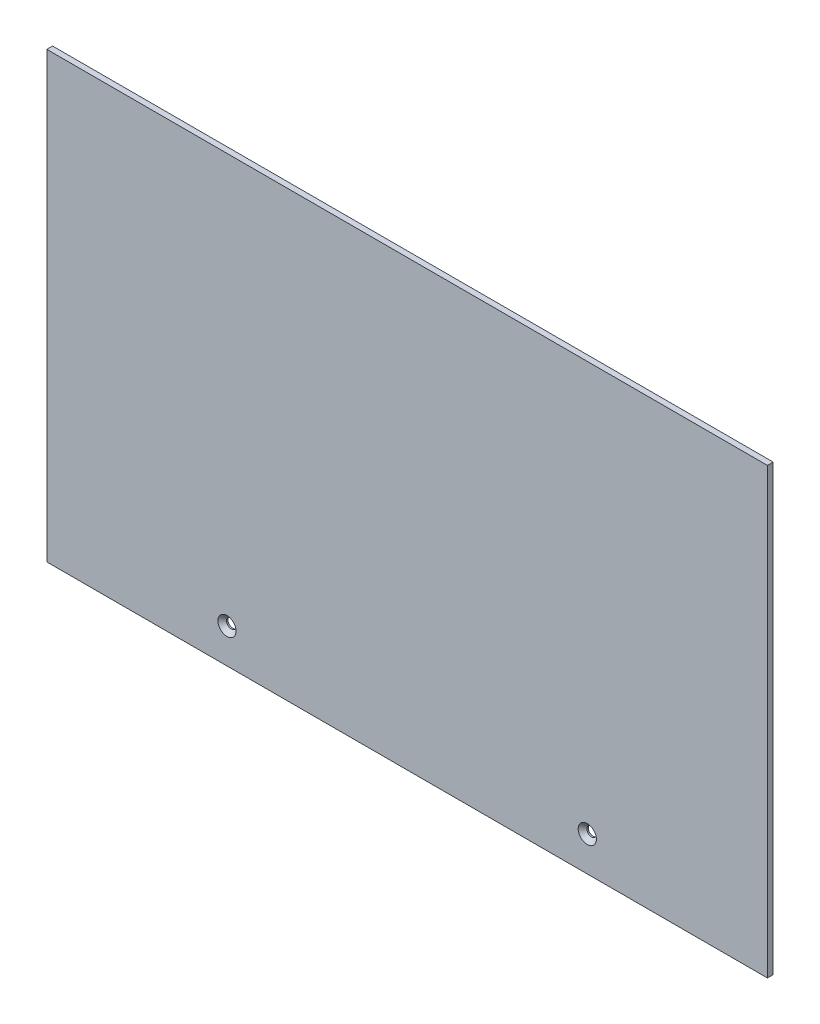
ISO-10303-21;
HEADER;
FILE_DESCRIPTION(('STEP AP214'),'2;1');
FILE_NAME('part.step','',(''),(''),'','','');
FILE_SCHEMA(('AUTOMOTIVE_DESIGN { 1 0 10303 214 1 1 1 1 }'));
ENDSEC;
DATA;
#1=APPLICATION_CONTEXT('core data for automotive mechanical design processes');
#2=APPLICATION_PROTOCOL_DEFINITION('international standard','automotive_design',2000,#1);
#3=PRODUCT_CONTEXT('',#1,'mechanical');
#4=PRODUCT('Part','Part','',(#3));
#5=PRODUCT_RELATED_PRODUCT_CATEGORY('part','',(#4));
#6=PRODUCT_DEFINITION_FORMATION('','',#4);
#7=PRODUCT_DEFINITION_CONTEXT('part definition',#1,'design');
#8=PRODUCT_DEFINITION('design','',#6,#7);
#9=PRODUCT_DEFINITION_SHAPE('','',#8);
#10=(LENGTH_UNIT() NAMED_UNIT(*) SI_UNIT(.MILLI.,.METRE.));
#11=(NAMED_UNIT(*) PLANE_ANGLE_UNIT() SI_UNIT($,.RADIAN.));
#12=(NAMED_UNIT(*) SI_UNIT($,.STERADIAN.) SOLID_ANGLE_UNIT());
#13=UNCERTAINTY_MEASURE_WITH_UNIT(LENGTH_MEASURE(1.E-05),#10,'distance_accuracy_value','');
#14=(GEOMETRIC_REPRESENTATION_CONTEXT(3) GLOBAL_UNCERTAINTY_ASSIGNED_CONTEXT((#13)) GLOBAL_UNIT_ASSIGNED_CONTEXT((#10,
#11,#12)) REPRESENTATION_CONTEXT('',''));
#15=CARTESIAN_POINT('',(0.,0.,0.));
#16=DIRECTION('',(0.,0.,1.));
#17=DIRECTION('',(1.,0.,0.));
#18=AXIS2_PLACEMENT_3D('',#15,#16,#17);
#19=CARTESIAN_POINT('',(0.,0.,-2.));
#20=DIRECTION('',(0.,0.,-1.));
#21=DIRECTION('',(-1.,0.,0.));
#22=AXIS2_PLACEMENT_3D('',#19,#20,#21);
#23=PLANE('',#22);
#24=DIRECTION('',(0.,-1.,0.));
#25=VECTOR('',#24,1.);
#26=CARTESIAN_POINT('',(-250.,308.,-2.));
#27=LINE('',#26,#25);
#28=CARTESIAN_POINT('',(-250.,308.,-2.));
#29=VERTEX_POINT('',#28);
#30=CARTESIAN_POINT('',(-250.,0.,-2.));
#31=VERTEX_POINT('',#30);
#32=EDGE_CURVE('E105',#29,#31,#27,.T.);
#33=ORIENTED_EDGE('',*,*,#32,.F.);
#34=DIRECTION('',(-1.,0.,0.));
#35=VECTOR('',#34,1.);
#36=CARTESIAN_POINT('',(250.,308.,-2.));
#37=LINE('',#36,#35);
#38=CARTESIAN_POINT('',(250.,308.,-2.));
#39=VERTEX_POINT('',#38);
#40=EDGE_CURVE('E77',#39,#29,#37,.T.);
#41=ORIENTED_EDGE('',*,*,#40,.F.);
#42=DIRECTION('',(0.,1.,0.));
#43=VECTOR('',#42,1.);
#44=CARTESIAN_POINT('',(250.,308.,-2.));
#45=LINE('',#44,#43);
#46=CARTESIAN_POINT('',(250.,0.,-2.));
#47=VERTEX_POINT('',#46);
#48=EDGE_CURVE('E75',#47,#39,#45,.T.);
#49=ORIENTED_EDGE('',*,*,#48,.F.);
#50=DIRECTION('',(1.,0.,0.));
#51=VECTOR('',#50,1.);
#52=CARTESIAN_POINT('',(250.,0.,-2.));
#53=LINE('',#52,#51);
#54=EDGE_CURVE('E94',#31,#47,#53,.T.);
#55=ORIENTED_EDGE('',*,*,#54,.F.);
#56=EDGE_LOOP('',(#33,#41,#49,#55));
#57=FACE_BOUND('',#56,.T.);
#58=CARTESIAN_POINT('',(125.,24.,-2.));
#59=DIRECTION('',(0.,0.,1.));
#60=DIRECTION('',(1.,0.,0.));
#61=AXIS2_PLACEMENT_3D('',#58,#59,#60);
#62=CIRCLE('',#61,3.3);
#63=CARTESIAN_POINT('',(128.3,24.,-2.));
#64=VERTEX_POINT('',#63);
#65=EDGE_CURVE('E104',#64,#64,#62,.T.);
#66=ORIENTED_EDGE('',*,*,#65,.T.);
#67=EDGE_LOOP('',(#66));
#68=FACE_BOUND('',#67,.T.);
#69=CARTESIAN_POINT('',(-125.,24.,-2.));
#70=DIRECTION('',(0.,0.,1.));
#71=DIRECTION('',(1.,0.,0.));
#72=AXIS2_PLACEMENT_3D('',#69,#70,#71);
#73=CIRCLE('',#72,3.29999999999998);
#74=CARTESIAN_POINT('',(-121.7,24.,-2.));
#75=VERTEX_POINT('',#74);
#76=EDGE_CURVE('E121',#75,#75,#73,.T.);
#77=ORIENTED_EDGE('',*,*,#76,.T.);
#78=EDGE_LOOP('',(#77));
#79=FACE_BOUND('',#78,.T.);
#80=ADVANCED_FACE('F36',(#57,#68,#79),#23,.T.);
#81=CARTESIAN_POINT('',(-250.,308.,2.));
#82=DIRECTION('',(1.,0.,0.));
#83=DIRECTION('',(0.,0.,-1.));
#84=AXIS2_PLACEMENT_3D('',#81,#82,#83);
#85=PLANE('',#84);
#86=ORIENTED_EDGE('',*,*,#32,.T.);
#87=DIRECTION('',(0.,0.,-1.));
#88=VECTOR('',#87,1.);
#89=CARTESIAN_POINT('',(-250.,0.,2.));
#90=LINE('',#89,#88);
#91=CARTESIAN_POINT('',(-250.,0.,2.));
#92=VERTEX_POINT('',#91);
#93=EDGE_CURVE('E11',#92,#31,#90,.T.);
#94=ORIENTED_EDGE('',*,*,#93,.F.);
#95=DIRECTION('',(0.,-1.,0.));
#96=VECTOR('',#95,1.);
#97=CARTESIAN_POINT('',(-250.,308.,2.));
#98=LINE('',#97,#96);
#99=CARTESIAN_POINT('',(-250.,308.,2.));
#100=VERTEX_POINT('',#99);
#101=EDGE_CURVE('E89',#100,#92,#98,.T.);
#102=ORIENTED_EDGE('',*,*,#101,.F.);
#103=DIRECTION('',(0.,0.,-1.));
#104=VECTOR('',#103,1.);
#105=CARTESIAN_POINT('',(-250.,308.,2.));
#106=LINE('',#105,#104);
#107=EDGE_CURVE('E98',#100,#29,#106,.T.);
#108=ORIENTED_EDGE('',*,*,#107,.T.);
#109=EDGE_LOOP('',(#86,#94,#102,#108));
#110=FACE_BOUND('',#109,.T.);
#111=ADVANCED_FACE('F37',(#110),#85,.F.);
#112=CARTESIAN_POINT('',(250.,0.,2.));
#113=DIRECTION('',(0.,1.,0.));
#114=DIRECTION('',(-1.,0.,0.));
#115=AXIS2_PLACEMENT_3D('',#112,#113,#114);
#116=PLANE('',#115);
#117=ORIENTED_EDGE('',*,*,#54,.T.);
#118=DIRECTION('',(0.,0.,-1.));
#119=VECTOR('',#118,1.);
#120=CARTESIAN_POINT('',(250.,0.,2.));
#121=LINE('',#120,#119);
#122=CARTESIAN_POINT('',(250.,0.,2.));
#123=VERTEX_POINT('',#122);
#124=EDGE_CURVE('E50',#123,#47,#121,.T.);
#125=ORIENTED_EDGE('',*,*,#124,.F.);
#126=DIRECTION('',(1.,0.,0.));
#127=VECTOR('',#126,1.);
#128=CARTESIAN_POINT('',(250.,0.,2.));
#129=LINE('',#128,#127);
#130=EDGE_CURVE('E83',#92,#123,#129,.T.);
#131=ORIENTED_EDGE('',*,*,#130,.F.);
#132=ORIENTED_EDGE('',*,*,#93,.T.);
#133=EDGE_LOOP('',(#117,#125,#131,#132));
#134=FACE_BOUND('',#133,.T.);
#135=ADVANCED_FACE('F91',(#134),#116,.F.);
#136=CARTESIAN_POINT('',(250.,308.,2.));
#137=DIRECTION('',(-1.,0.,0.));
#138=DIRECTION('',(0.,0.,1.));
#139=AXIS2_PLACEMENT_3D('',#136,#137,#138);
#140=PLANE('',#139);
#141=ORIENTED_EDGE('',*,*,#48,.T.);
#142=DIRECTION('',(0.,0.,-1.));
#143=VECTOR('',#142,1.);
#144=CARTESIAN_POINT('',(250.,308.,2.));
#145=LINE('',#144,#143);
#146=CARTESIAN_POINT('',(250.,308.,2.));
#147=VERTEX_POINT('',#146);
#148=EDGE_CURVE('E92',#147,#39,#145,.T.);
#149=ORIENTED_EDGE('',*,*,#148,.F.);
#150=DIRECTION('',(0.,1.,0.));
#151=VECTOR('',#150,1.);
#152=CARTESIAN_POINT('',(250.,308.,2.));
#153=LINE('',#152,#151);
#154=EDGE_CURVE('E86',#123,#147,#153,.T.);
#155=ORIENTED_EDGE('',*,*,#154,.F.);
#156=ORIENTED_EDGE('',*,*,#124,.T.);
#157=EDGE_LOOP('',(#141,#149,#155,#156));
#158=FACE_BOUND('',#157,.T.);
#159=ADVANCED_FACE('F96',(#158),#140,.F.);
#160=CARTESIAN_POINT('',(250.,308.,2.));
#161=DIRECTION('',(0.,-1.,0.));
#162=DIRECTION('',(1.,0.,0.));
#163=AXIS2_PLACEMENT_3D('',#160,#161,#162);
#164=PLANE('',#163);
#165=ORIENTED_EDGE('',*,*,#40,.T.);
#166=ORIENTED_EDGE('',*,*,#107,.F.);
#167=DIRECTION('',(-1.,0.,0.));
#168=VECTOR('',#167,1.);
#169=CARTESIAN_POINT('',(250.,308.,2.));
#170=LINE('',#169,#168);
#171=EDGE_CURVE('E54',#147,#100,#170,.T.);
#172=ORIENTED_EDGE('',*,*,#171,.F.);
#173=ORIENTED_EDGE('',*,*,#148,.T.);
#174=EDGE_LOOP('',(#165,#166,#172,#173));
#175=FACE_BOUND('',#174,.T.);
#176=ADVANCED_FACE('F109',(#175),#164,.F.);
#177=CARTESIAN_POINT('',(0.,0.,2.));
#178=DIRECTION('',(0.,0.,-1.));
#179=DIRECTION('',(-1.,0.,0.));
#180=AXIS2_PLACEMENT_3D('',#177,#178,#179);
#181=PLANE('',#180);
#182=CARTESIAN_POINT('',(-125.,24.,2.));
#183=DIRECTION('',(0.,0.,1.));
#184=DIRECTION('',(1.,0.,0.));
#185=AXIS2_PLACEMENT_3D('',#182,#183,#184);
#186=CIRCLE('',#185,6.3);
#187=CARTESIAN_POINT('',(-118.7,24.,2.));
#188=VERTEX_POINT('',#187);
#189=EDGE_CURVE('E128',#188,#188,#186,.T.);
#190=ORIENTED_EDGE('',*,*,#189,.F.);
#191=EDGE_LOOP('',(#190));
#192=FACE_BOUND('',#191,.T.);
#193=CARTESIAN_POINT('',(125.,24.,2.));
#194=DIRECTION('',(0.,0.,1.));
#195=DIRECTION('',(1.,0.,0.));
#196=AXIS2_PLACEMENT_3D('',#193,#194,#195);
#197=CIRCLE('',#196,6.3);
#198=CARTESIAN_POINT('',(131.3,24.,2.));
#199=VERTEX_POINT('',#198);
#200=EDGE_CURVE('E122',#199,#199,#197,.T.);
#201=ORIENTED_EDGE('',*,*,#200,.F.);
#202=EDGE_LOOP('',(#201));
#203=FACE_BOUND('',#202,.T.);
#204=ORIENTED_EDGE('',*,*,#101,.T.);
#205=ORIENTED_EDGE('',*,*,#130,.T.);
#206=ORIENTED_EDGE('',*,*,#154,.T.);
#207=ORIENTED_EDGE('',*,*,#171,.T.);
#208=EDGE_LOOP('',(#204,#205,#206,#207));
#209=FACE_BOUND('',#208,.T.);
#210=ADVANCED_FACE('F88',(#192,#203,#209),#181,.F.);
#211=CARTESIAN_POINT('',(125.,24.,2.));
#212=DIRECTION('',(0.,0.,1.));
#213=DIRECTION('',(1.,0.,0.));
#214=AXIS2_PLACEMENT_3D('',#211,#212,#213);
#215=CYLINDRICAL_SURFACE('',#214,3.3);
#216=ORIENTED_EDGE('',*,*,#65,.F.);
#217=EDGE_LOOP('',(#216));
#218=FACE_BOUND('',#217,.T.);
#219=CARTESIAN_POINT('',(125.,24.,-1.00000000000002));
#220=DIRECTION('',(0.,0.,1.));
#221=DIRECTION('',(1.,0.,0.));
#222=AXIS2_PLACEMENT_3D('',#219,#220,#221);
#223=CIRCLE('',#222,3.3);
#224=CARTESIAN_POINT('',(128.3,24.,-1.00000000000002));
#225=VERTEX_POINT('',#224);
#226=EDGE_CURVE('E117',#225,#225,#223,.T.);
#227=ORIENTED_EDGE('',*,*,#226,.T.);
#228=EDGE_LOOP('',(#227));
#229=FACE_BOUND('',#228,.T.);
#230=ADVANCED_FACE('F140',(#218,#229),#215,.F.);
#231=CARTESIAN_POINT('',(125.,24.,2.));
#232=DIRECTION('',(0.,0.,1.));
#233=DIRECTION('',(1.,0.,0.));
#234=AXIS2_PLACEMENT_3D('',#231,#232,#233);
#235=CONICAL_SURFACE('',#234,6.3,0.785398163397446);
#236=ORIENTED_EDGE('',*,*,#226,.F.);
#237=EDGE_LOOP('',(#236));
#238=FACE_BOUND('',#237,.T.);
#239=ORIENTED_EDGE('',*,*,#200,.T.);
#240=EDGE_LOOP('',(#239));
#241=FACE_BOUND('',#240,.T.);
#242=ADVANCED_FACE('F142',(#238,#241),#235,.F.);
#243=CARTESIAN_POINT('',(-125.,24.,2.));
#244=DIRECTION('',(0.,0.,1.));
#245=DIRECTION('',(1.,0.,0.));
#246=AXIS2_PLACEMENT_3D('',#243,#244,#245);
#247=CYLINDRICAL_SURFACE('',#246,3.29999999999998);
#248=ORIENTED_EDGE('',*,*,#76,.F.);
#249=EDGE_LOOP('',(#248));
#250=FACE_BOUND('',#249,.T.);
#251=CARTESIAN_POINT('',(-125.,24.,-1.00000000000002));
#252=DIRECTION('',(0.,0.,1.));
#253=DIRECTION('',(1.,0.,0.));
#254=AXIS2_PLACEMENT_3D('',#251,#252,#253);
#255=CIRCLE('',#254,3.29999999999998);
#256=CARTESIAN_POINT('',(-121.7,24.,-1.00000000000002));
#257=VERTEX_POINT('',#256);
#258=EDGE_CURVE('E130',#257,#257,#255,.T.);
#259=ORIENTED_EDGE('',*,*,#258,.T.);
#260=EDGE_LOOP('',(#259));
#261=FACE_BOUND('',#260,.T.);
#262=ADVANCED_FACE('F145',(#250,#261),#247,.F.);
#263=CARTESIAN_POINT('',(-125.,24.,2.));
#264=DIRECTION('',(0.,0.,1.));
#265=DIRECTION('',(1.,0.,0.));
#266=AXIS2_PLACEMENT_3D('',#263,#264,#265);
#267=CONICAL_SURFACE('',#266,6.3,0.785398163397448);
#268=ORIENTED_EDGE('',*,*,#258,.F.);
#269=EDGE_LOOP('',(#268));
#270=FACE_BOUND('',#269,.T.);
#271=ORIENTED_EDGE('',*,*,#189,.T.);
#272=EDGE_LOOP('',(#271));
#273=FACE_BOUND('',#272,.T.);
#274=ADVANCED_FACE('F133',(#270,#273),#267,.F.);
#275=CLOSED_SHELL('',(#80,#111,#135,#159,#176,#210,#230,#242,#262,#274));
#276=MANIFOLD_SOLID_BREP('B2',#275);
#277=ADVANCED_BREP_SHAPE_REPRESENTATION('',(#18,#276),#14);
#278=SHAPE_DEFINITION_REPRESENTATION(#9,#277);
ENDSEC;
END-ISO-10303-21;
